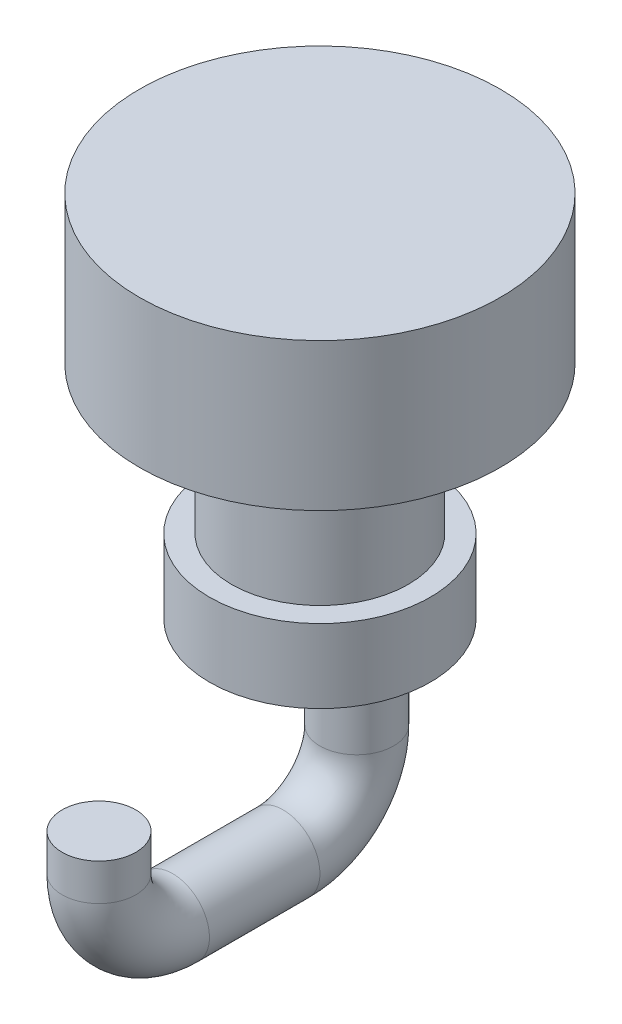
ISO-10303-21;
HEADER;
FILE_DESCRIPTION(('STEP AP214'),'2;1');
FILE_NAME('part.step','',(''),(''),'','','');
FILE_SCHEMA(('AUTOMOTIVE_DESIGN { 1 0 10303 214 1 1 1 1 }'));
ENDSEC;
DATA;
#1=APPLICATION_CONTEXT('core data for automotive mechanical design processes');
#2=APPLICATION_PROTOCOL_DEFINITION('international standard','automotive_design',2000,#1);
#3=PRODUCT_CONTEXT('',#1,'mechanical');
#4=PRODUCT('Part','Part','',(#3));
#5=PRODUCT_RELATED_PRODUCT_CATEGORY('part','',(#4));
#6=PRODUCT_DEFINITION_FORMATION('','',#4);
#7=PRODUCT_DEFINITION_CONTEXT('part definition',#1,'design');
#8=PRODUCT_DEFINITION('design','',#6,#7);
#9=PRODUCT_DEFINITION_SHAPE('','',#8);
#10=(LENGTH_UNIT() NAMED_UNIT(*) SI_UNIT(.MILLI.,.METRE.));
#11=(NAMED_UNIT(*) PLANE_ANGLE_UNIT() SI_UNIT($,.RADIAN.));
#12=(NAMED_UNIT(*) SI_UNIT($,.STERADIAN.) SOLID_ANGLE_UNIT());
#13=UNCERTAINTY_MEASURE_WITH_UNIT(LENGTH_MEASURE(1.E-05),#10,'distance_accuracy_value','');
#14=(GEOMETRIC_REPRESENTATION_CONTEXT(3) GLOBAL_UNCERTAINTY_ASSIGNED_CONTEXT((#13)) GLOBAL_UNIT_ASSIGNED_CONTEXT((#10,
#11,#12)) REPRESENTATION_CONTEXT('',''));
#15=CARTESIAN_POINT('',(0.,0.,0.));
#16=DIRECTION('',(0.,0.,1.));
#17=DIRECTION('',(1.,0.,0.));
#18=AXIS2_PLACEMENT_3D('',#15,#16,#17);
#19=CARTESIAN_POINT('',(3.81,-12.7,0.));
#20=DIRECTION('',(0.,-1.,0.));
#21=DIRECTION('',(0.,0.,-1.));
#22=AXIS2_PLACEMENT_3D('',#19,#20,#21);
#23=PLANE('',#22);
#24=CARTESIAN_POINT('',(0.,-12.7,0.));
#25=DIRECTION('',(0.,-1.,0.));
#26=DIRECTION('',(0.,0.,-1.));
#27=AXIS2_PLACEMENT_3D('',#24,#25,#26);
#28=CIRCLE('',#27,3.81);
#29=CARTESIAN_POINT('',(0.,-12.7,-3.81));
#30=VERTEX_POINT('',#29);
#31=EDGE_CURVE('E53',#30,#30,#28,.T.);
#32=ORIENTED_EDGE('',*,*,#31,.T.);
#33=EDGE_LOOP('',(#32));
#34=FACE_BOUND('',#33,.T.);
#35=CARTESIAN_POINT('',(0.,-12.7,-1.27));
#36=DIRECTION('',(0.,-1.,0.));
#37=DIRECTION('',(0.,0.,-1.));
#38=AXIS2_PLACEMENT_3D('',#35,#36,#37);
#39=CIRCLE('',#38,1.27);
#40=CARTESIAN_POINT('',(0.,-12.7,-2.54));
#41=VERTEX_POINT('',#40);
#42=EDGE_CURVE('E69',#41,#41,#39,.T.);
#43=ORIENTED_EDGE('',*,*,#42,.F.);
#44=EDGE_LOOP('',(#43));
#45=FACE_BOUND('',#44,.T.);
#46=ADVANCED_FACE('F30',(#34,#45),#23,.T.);
#47=CARTESIAN_POINT('',(0.,0.,0.));
#48=DIRECTION('',(0.,1.,0.));
#49=DIRECTION('',(0.,0.,1.));
#50=AXIS2_PLACEMENT_3D('',#47,#48,#49);
#51=PLANE('',#50);
#52=CARTESIAN_POINT('',(0.,0.,0.));
#53=DIRECTION('',(0.,-1.,0.));
#54=DIRECTION('',(0.,0.,-1.));
#55=AXIS2_PLACEMENT_3D('',#52,#53,#54);
#56=CIRCLE('',#55,6.223);
#57=CARTESIAN_POINT('',(0.,0.,-6.223));
#58=VERTEX_POINT('',#57);
#59=EDGE_CURVE('E10',#58,#58,#56,.T.);
#60=ORIENTED_EDGE('',*,*,#59,.F.);
#61=EDGE_LOOP('',(#60));
#62=FACE_BOUND('',#61,.T.);
#63=ADVANCED_FACE('F32',(#62),#51,.T.);
#64=CARTESIAN_POINT('',(0.,-12.7,0.));
#65=DIRECTION('',(0.,-1.,0.));
#66=DIRECTION('',(0.,0.,-1.));
#67=AXIS2_PLACEMENT_3D('',#64,#65,#66);
#68=CYLINDRICAL_SURFACE('',#67,6.223);
#69=ORIENTED_EDGE('',*,*,#59,.T.);
#70=EDGE_LOOP('',(#69));
#71=FACE_BOUND('',#70,.T.);
#72=CARTESIAN_POINT('',(0.,-5.08,0.));
#73=DIRECTION('',(0.,-1.,0.));
#74=DIRECTION('',(0.,0.,-1.));
#75=AXIS2_PLACEMENT_3D('',#72,#73,#74);
#76=CIRCLE('',#75,6.223);
#77=CARTESIAN_POINT('',(0.,-5.08,-6.223));
#78=VERTEX_POINT('',#77);
#79=EDGE_CURVE('E37',#78,#78,#76,.T.);
#80=ORIENTED_EDGE('',*,*,#79,.F.);
#81=EDGE_LOOP('',(#80));
#82=FACE_BOUND('',#81,.T.);
#83=ADVANCED_FACE('F91',(#71,#82),#68,.T.);
#84=CARTESIAN_POINT('',(6.223,-5.08,0.));
#85=DIRECTION('',(0.,-1.,0.));
#86=DIRECTION('',(0.,0.,-1.));
#87=AXIS2_PLACEMENT_3D('',#84,#85,#86);
#88=PLANE('',#87);
#89=ORIENTED_EDGE('',*,*,#79,.T.);
#90=EDGE_LOOP('',(#89));
#91=FACE_BOUND('',#90,.T.);
#92=CARTESIAN_POINT('',(0.,-5.08,0.));
#93=DIRECTION('',(0.,-1.,0.));
#94=DIRECTION('',(0.,0.,-1.));
#95=AXIS2_PLACEMENT_3D('',#92,#93,#94);
#96=CIRCLE('',#95,3.048);
#97=CARTESIAN_POINT('',(0.,-5.08,-3.048));
#98=VERTEX_POINT('',#97);
#99=EDGE_CURVE('E41',#98,#98,#96,.T.);
#100=ORIENTED_EDGE('',*,*,#99,.F.);
#101=EDGE_LOOP('',(#100));
#102=FACE_BOUND('',#101,.T.);
#103=ADVANCED_FACE('F108',(#91,#102),#88,.T.);
#104=CARTESIAN_POINT('',(0.,-12.7,0.));
#105=DIRECTION('',(0.,-1.,0.));
#106=DIRECTION('',(0.,0.,-1.));
#107=AXIS2_PLACEMENT_3D('',#104,#105,#106);
#108=CYLINDRICAL_SURFACE('',#107,3.048);
#109=ORIENTED_EDGE('',*,*,#99,.T.);
#110=EDGE_LOOP('',(#109));
#111=FACE_BOUND('',#110,.T.);
#112=CARTESIAN_POINT('',(0.,-10.16,0.));
#113=DIRECTION('',(0.,-1.,0.));
#114=DIRECTION('',(0.,0.,-1.));
#115=AXIS2_PLACEMENT_3D('',#112,#113,#114);
#116=CIRCLE('',#115,3.048);
#117=CARTESIAN_POINT('',(0.,-10.16,-3.048));
#118=VERTEX_POINT('',#117);
#119=EDGE_CURVE('E45',#118,#118,#116,.T.);
#120=ORIENTED_EDGE('',*,*,#119,.F.);
#121=EDGE_LOOP('',(#120));
#122=FACE_BOUND('',#121,.T.);
#123=ADVANCED_FACE('F104',(#111,#122),#108,.T.);
#124=CARTESIAN_POINT('',(3.048,-10.16,0.));
#125=DIRECTION('',(0.,1.,0.));
#126=DIRECTION('',(0.,0.,1.));
#127=AXIS2_PLACEMENT_3D('',#124,#125,#126);
#128=PLANE('',#127);
#129=ORIENTED_EDGE('',*,*,#119,.T.);
#130=EDGE_LOOP('',(#129));
#131=FACE_BOUND('',#130,.T.);
#132=CARTESIAN_POINT('',(0.,-10.16,0.));
#133=DIRECTION('',(0.,-1.,0.));
#134=DIRECTION('',(0.,0.,-1.));
#135=AXIS2_PLACEMENT_3D('',#132,#133,#134);
#136=CIRCLE('',#135,3.81);
#137=CARTESIAN_POINT('',(0.,-10.16,-3.81));
#138=VERTEX_POINT('',#137);
#139=EDGE_CURVE('E50',#138,#138,#136,.T.);
#140=ORIENTED_EDGE('',*,*,#139,.F.);
#141=EDGE_LOOP('',(#140));
#142=FACE_BOUND('',#141,.T.);
#143=ADVANCED_FACE('F100',(#131,#142),#128,.T.);
#144=CARTESIAN_POINT('',(0.,-12.7,0.));
#145=DIRECTION('',(0.,-1.,0.));
#146=DIRECTION('',(0.,0.,-1.));
#147=AXIS2_PLACEMENT_3D('',#144,#145,#146);
#148=CYLINDRICAL_SURFACE('',#147,3.81);
#149=ORIENTED_EDGE('',*,*,#139,.T.);
#150=EDGE_LOOP('',(#149));
#151=FACE_BOUND('',#150,.T.);
#152=ORIENTED_EDGE('',*,*,#31,.F.);
#153=EDGE_LOOP('',(#152));
#154=FACE_BOUND('',#153,.T.);
#155=ADVANCED_FACE('F97',(#151,#154),#148,.T.);
#156=CARTESIAN_POINT('',(0.,-16.51,7.62));
#157=DIRECTION('',(0.,1.,0.));
#158=DIRECTION('',(0.,0.,1.));
#159=AXIS2_PLACEMENT_3D('',#156,#157,#158);
#160=CYLINDRICAL_SURFACE('',#159,1.27);
#161=CARTESIAN_POINT('',(0.,-16.51,7.62));
#162=DIRECTION('',(0.,1.,0.));
#163=DIRECTION('',(0.,0.,1.));
#164=AXIS2_PLACEMENT_3D('',#161,#162,#163);
#165=CIRCLE('',#164,1.27);
#166=CARTESIAN_POINT('',(0.,-16.51,8.89));
#167=VERTEX_POINT('',#166);
#168=EDGE_CURVE('E59',#167,#167,#165,.T.);
#169=ORIENTED_EDGE('',*,*,#168,.T.);
#170=EDGE_LOOP('',(#169));
#171=FACE_BOUND('',#170,.T.);
#172=CARTESIAN_POINT('',(0.,-15.24,7.62));
#173=DIRECTION('',(0.,1.,0.));
#174=DIRECTION('',(0.,0.,1.));
#175=AXIS2_PLACEMENT_3D('',#172,#173,#174);
#176=CIRCLE('',#175,1.27);
#177=CARTESIAN_POINT('',(0.,-15.24,8.89));
#178=VERTEX_POINT('',#177);
#179=EDGE_CURVE('E56',#178,#178,#176,.T.);
#180=ORIENTED_EDGE('',*,*,#179,.F.);
#181=EDGE_LOOP('',(#180));
#182=FACE_BOUND('',#181,.T.);
#183=ADVANCED_FACE('F95',(#171,#182),#160,.T.);
#184=CARTESIAN_POINT('',(0.,-16.51,5.08));
#185=DIRECTION('',(-1.,0.,0.));
#186=DIRECTION('',(0.,0.,1.));
#187=AXIS2_PLACEMENT_3D('',#184,#185,#186);
#188=TOROIDAL_SURFACE('',#187,2.54,1.27);
#189=CARTESIAN_POINT('',(0.,-19.05,5.08000000000002));
#190=DIRECTION('',(0.,0.,1.));
#191=DIRECTION('',(0.,-1.,0.));
#192=AXIS2_PLACEMENT_3D('',#189,#190,#191);
#193=CIRCLE('',#192,1.27);
#194=CARTESIAN_POINT('',(0.,-20.32,5.08000000000003));
#195=VERTEX_POINT('',#194);
#196=EDGE_CURVE('E62',#195,#195,#193,.T.);
#197=CARTESIAN_POINT('',(0.,-16.51,5.08));
#198=DIRECTION('',(-1.,0.,0.));
#199=DIRECTION('',(0.,0.,1.));
#200=AXIS2_PLACEMENT_3D('',#197,#198,#199);
#201=CIRCLE('',#200,3.81);
#202=EDGE_CURVE('',#195,#167,#201,.T.);
#203=ORIENTED_EDGE('',*,*,#196,.T.);
#204=ORIENTED_EDGE('',*,*,#168,.F.);
#205=ORIENTED_EDGE('',*,*,#202,.T.);
#206=ORIENTED_EDGE('',*,*,#202,.F.);
#207=EDGE_LOOP('',(#203,#205,#204,#206));
#208=FACE_BOUND('',#207,.T.);
#209=ADVANCED_FACE('F139',(#208),#188,.T.);
#210=CARTESIAN_POINT('',(0.,-19.05,1.27000000000003));
#211=DIRECTION('',(0.,0.,1.));
#212=DIRECTION('',(1.,0.,0.));
#213=AXIS2_PLACEMENT_3D('',#210,#211,#212);
#214=CYLINDRICAL_SURFACE('',#213,1.27);
#215=CARTESIAN_POINT('',(0.,-19.05,1.27000000000003));
#216=DIRECTION('',(0.,0.,1.));
#217=DIRECTION('',(0.,-1.,0.));
#218=AXIS2_PLACEMENT_3D('',#215,#216,#217);
#219=CIRCLE('',#218,1.27);
#220=CARTESIAN_POINT('',(0.,-20.32,1.27000000000004));
#221=VERTEX_POINT('',#220);
#222=EDGE_CURVE('E65',#221,#221,#219,.T.);
#223=ORIENTED_EDGE('',*,*,#222,.T.);
#224=EDGE_LOOP('',(#223));
#225=FACE_BOUND('',#224,.T.);
#226=ORIENTED_EDGE('',*,*,#196,.F.);
#227=EDGE_LOOP('',(#226));
#228=FACE_BOUND('',#227,.T.);
#229=ADVANCED_FACE('F146',(#225,#228),#214,.T.);
#230=CARTESIAN_POINT('',(0.,-16.51,1.27));
#231=DIRECTION('',(-1.,0.,0.));
#232=DIRECTION('',(0.,0.,1.));
#233=AXIS2_PLACEMENT_3D('',#230,#231,#232);
#234=TOROIDAL_SURFACE('',#233,2.54,1.27);
#235=CARTESIAN_POINT('',(0.,-16.51,-1.27));
#236=DIRECTION('',(0.,-1.,0.));
#237=DIRECTION('',(0.,0.,-1.));
#238=AXIS2_PLACEMENT_3D('',#235,#236,#237);
#239=CIRCLE('',#238,1.27);
#240=CARTESIAN_POINT('',(0.,-16.51,-2.54));
#241=VERTEX_POINT('',#240);
#242=EDGE_CURVE('E68',#241,#241,#239,.T.);
#243=CARTESIAN_POINT('',(0.,-16.51,1.27));
#244=DIRECTION('',(-1.,0.,0.));
#245=DIRECTION('',(0.,0.,1.));
#246=AXIS2_PLACEMENT_3D('',#243,#244,#245);
#247=CIRCLE('',#246,3.81);
#248=EDGE_CURVE('',#241,#221,#247,.T.);
#249=ORIENTED_EDGE('',*,*,#242,.T.);
#250=ORIENTED_EDGE('',*,*,#222,.F.);
#251=ORIENTED_EDGE('',*,*,#248,.T.);
#252=ORIENTED_EDGE('',*,*,#248,.F.);
#253=EDGE_LOOP('',(#249,#251,#250,#252));
#254=FACE_BOUND('',#253,.T.);
#255=ADVANCED_FACE('F75',(#254),#234,.T.);
#256=CARTESIAN_POINT('',(0.,-16.51,-1.27));
#257=DIRECTION('',(0.,1.,0.));
#258=DIRECTION('',(0.,0.,1.));
#259=AXIS2_PLACEMENT_3D('',#256,#257,#258);
#260=CYLINDRICAL_SURFACE('',#259,1.27);
#261=ORIENTED_EDGE('',*,*,#242,.F.);
#262=EDGE_LOOP('',(#261));
#263=FACE_BOUND('',#262,.T.);
#264=ORIENTED_EDGE('',*,*,#42,.T.);
#265=EDGE_LOOP('',(#264));
#266=FACE_BOUND('',#265,.T.);
#267=ADVANCED_FACE('F78',(#263,#266),#260,.T.);
#268=CARTESIAN_POINT('',(0.,-15.24,7.62));
#269=DIRECTION('',(0.,1.,0.));
#270=DIRECTION('',(0.,0.,1.));
#271=AXIS2_PLACEMENT_3D('',#268,#269,#270);
#272=PLANE('',#271);
#273=ORIENTED_EDGE('',*,*,#179,.T.);
#274=EDGE_LOOP('',(#273));
#275=FACE_BOUND('',#274,.T.);
#276=ADVANCED_FACE('F81',(#275),#272,.T.);
#277=CLOSED_SHELL('',(#46,#63,#83,#103,#123,#143,#155,#183,#209,#229,#255,#267,#276));
#278=MANIFOLD_SOLID_BREP('B2',#277);
#279=ADVANCED_BREP_SHAPE_REPRESENTATION('',(#18,#278),#14);
#280=SHAPE_DEFINITION_REPRESENTATION(#9,#279);
ENDSEC;
END-ISO-10303-21;
